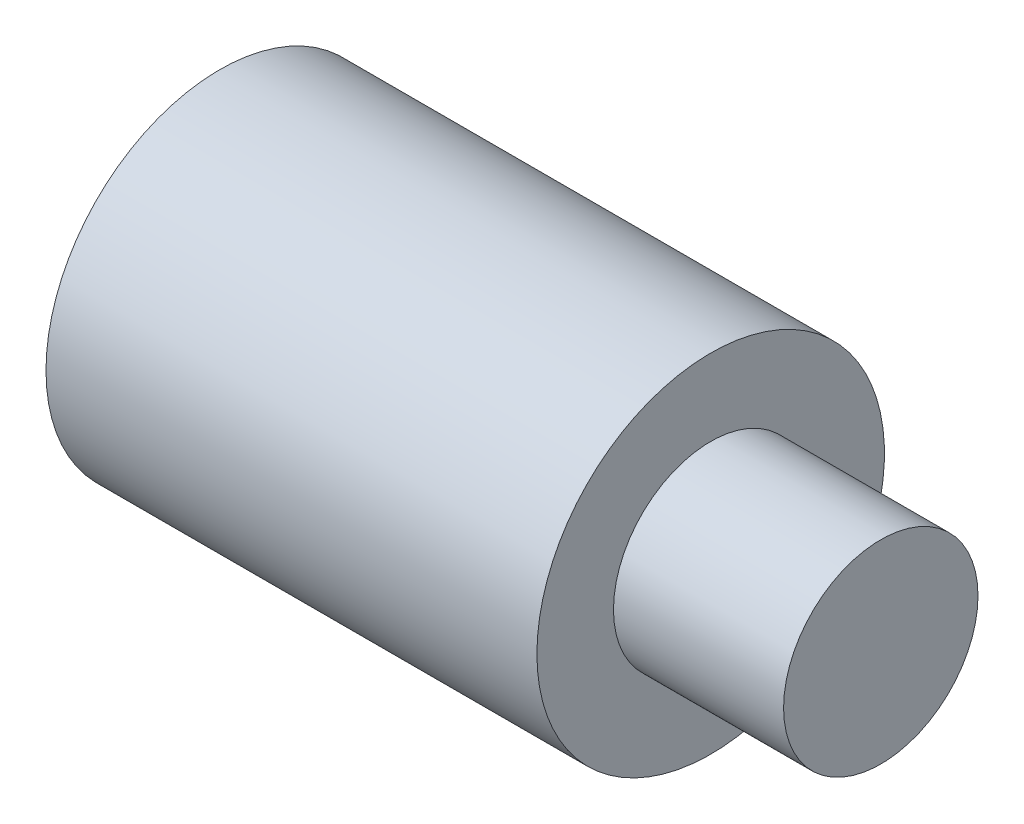
ISO-10303-21;
HEADER;
FILE_DESCRIPTION(('STEP AP214'),'2;1');
FILE_NAME('part.step','',(''),(''),'','','');
FILE_SCHEMA(('AUTOMOTIVE_DESIGN { 1 0 10303 214 1 1 1 1 }'));
ENDSEC;
DATA;
#1=APPLICATION_CONTEXT('core data for automotive mechanical design processes');
#2=APPLICATION_PROTOCOL_DEFINITION('international standard','automotive_design',2000,#1);
#3=PRODUCT_CONTEXT('',#1,'mechanical');
#4=PRODUCT('Part','Part','',(#3));
#5=PRODUCT_RELATED_PRODUCT_CATEGORY('part','',(#4));
#6=PRODUCT_DEFINITION_FORMATION('','',#4);
#7=PRODUCT_DEFINITION_CONTEXT('part definition',#1,'design');
#8=PRODUCT_DEFINITION('design','',#6,#7);
#9=PRODUCT_DEFINITION_SHAPE('','',#8);
#10=(LENGTH_UNIT() NAMED_UNIT(*) SI_UNIT(.MILLI.,.METRE.));
#11=(NAMED_UNIT(*) PLANE_ANGLE_UNIT() SI_UNIT($,.RADIAN.));
#12=(NAMED_UNIT(*) SI_UNIT($,.STERADIAN.) SOLID_ANGLE_UNIT());
#13=UNCERTAINTY_MEASURE_WITH_UNIT(LENGTH_MEASURE(1.E-05),#10,'distance_accuracy_value','');
#14=(GEOMETRIC_REPRESENTATION_CONTEXT(3) GLOBAL_UNCERTAINTY_ASSIGNED_CONTEXT((#13)) GLOBAL_UNIT_ASSIGNED_CONTEXT((#10,
#11,#12)) REPRESENTATION_CONTEXT('',''));
#15=CARTESIAN_POINT('',(0.,0.,0.));
#16=DIRECTION('',(0.,0.,1.));
#17=DIRECTION('',(1.,0.,0.));
#18=AXIS2_PLACEMENT_3D('',#15,#16,#17);
#19=CARTESIAN_POINT('',(8.6,-2.075,0.));
#20=DIRECTION('',(1.,0.,0.));
#21=DIRECTION('',(0.,0.,-1.));
#22=AXIS2_PLACEMENT_3D('',#19,#20,#21);
#23=PLANE('',#22);
#24=CARTESIAN_POINT('',(8.6,-2.075,0.));
#25=DIRECTION('',(-1.,0.,0.));
#26=DIRECTION('',(0.,0.,1.));
#27=AXIS2_PLACEMENT_3D('',#24,#25,#26);
#28=CIRCLE('',#27,2.075);
#29=CARTESIAN_POINT('',(8.6,-2.075,2.075));
#30=VERTEX_POINT('',#29);
#31=EDGE_CURVE('E10',#30,#30,#28,.T.);
#32=ORIENTED_EDGE('',*,*,#31,.T.);
#33=EDGE_LOOP('',(#32));
#34=FACE_BOUND('',#33,.T.);
#35=ADVANCED_FACE('F30',(#34),#23,.F.);
#36=CARTESIAN_POINT('',(8.6,-2.075,0.));
#37=DIRECTION('',(-1.,0.,0.));
#38=DIRECTION('',(0.,0.,1.));
#39=AXIS2_PLACEMENT_3D('',#36,#37,#38);
#40=CYLINDRICAL_SURFACE('',#39,2.075);
#41=ORIENTED_EDGE('',*,*,#31,.F.);
#42=EDGE_LOOP('',(#41));
#43=FACE_BOUND('',#42,.T.);
#44=CARTESIAN_POINT('',(0.,-2.075,0.));
#45=DIRECTION('',(-1.,0.,0.));
#46=DIRECTION('',(0.,0.,1.));
#47=AXIS2_PLACEMENT_3D('',#44,#45,#46);
#48=CIRCLE('',#47,2.075);
#49=CARTESIAN_POINT('',(0.,-2.075,2.075));
#50=VERTEX_POINT('',#49);
#51=EDGE_CURVE('E36',#50,#50,#48,.T.);
#52=ORIENTED_EDGE('',*,*,#51,.T.);
#53=EDGE_LOOP('',(#52));
#54=FACE_BOUND('',#53,.T.);
#55=ADVANCED_FACE('F68',(#43,#54),#40,.F.);
#56=CARTESIAN_POINT('',(0.,1.5,0.));
#57=DIRECTION('',(1.,0.,0.));
#58=DIRECTION('',(0.,0.,-1.));
#59=AXIS2_PLACEMENT_3D('',#56,#57,#58);
#60=PLANE('',#59);
#61=ORIENTED_EDGE('',*,*,#51,.F.);
#62=EDGE_LOOP('',(#61));
#63=FACE_BOUND('',#62,.T.);
#64=CARTESIAN_POINT('',(0.,-2.075,0.));
#65=DIRECTION('',(-1.,0.,0.));
#66=DIRECTION('',(0.,0.,1.));
#67=AXIS2_PLACEMENT_3D('',#64,#65,#66);
#68=CIRCLE('',#67,3.575);
#69=CARTESIAN_POINT('',(0.,-2.075,3.575));
#70=VERTEX_POINT('',#69);
#71=EDGE_CURVE('E40',#70,#70,#68,.T.);
#72=ORIENTED_EDGE('',*,*,#71,.T.);
#73=EDGE_LOOP('',(#72));
#74=FACE_BOUND('',#73,.T.);
#75=ADVANCED_FACE('F72',(#63,#74),#60,.F.);
#76=CARTESIAN_POINT('',(8.6,-2.075,0.));
#77=DIRECTION('',(-1.,0.,0.));
#78=DIRECTION('',(0.,0.,1.));
#79=AXIS2_PLACEMENT_3D('',#76,#77,#78);
#80=CYLINDRICAL_SURFACE('',#79,3.575);
#81=ORIENTED_EDGE('',*,*,#71,.F.);
#82=EDGE_LOOP('',(#81));
#83=FACE_BOUND('',#82,.T.);
#84=CARTESIAN_POINT('',(10.1,-2.075,0.));
#85=DIRECTION('',(-1.,0.,0.));
#86=DIRECTION('',(0.,0.,1.));
#87=AXIS2_PLACEMENT_3D('',#84,#85,#86);
#88=CIRCLE('',#87,3.575);
#89=CARTESIAN_POINT('',(10.1,-2.075,3.575));
#90=VERTEX_POINT('',#89);
#91=EDGE_CURVE('E44',#90,#90,#88,.T.);
#92=ORIENTED_EDGE('',*,*,#91,.T.);
#93=EDGE_LOOP('',(#92));
#94=FACE_BOUND('',#93,.T.);
#95=ADVANCED_FACE('F77',(#83,#94),#80,.T.);
#96=CARTESIAN_POINT('',(10.1,-0.075,0.));
#97=DIRECTION('',(-1.,0.,0.));
#98=DIRECTION('',(0.,0.,1.));
#99=AXIS2_PLACEMENT_3D('',#96,#97,#98);
#100=PLANE('',#99);
#101=ORIENTED_EDGE('',*,*,#91,.F.);
#102=EDGE_LOOP('',(#101));
#103=FACE_BOUND('',#102,.T.);
#104=CARTESIAN_POINT('',(10.1,-2.075,0.));
#105=DIRECTION('',(-1.,0.,0.));
#106=DIRECTION('',(0.,0.,1.));
#107=AXIS2_PLACEMENT_3D('',#104,#105,#106);
#108=CIRCLE('',#107,2.);
#109=CARTESIAN_POINT('',(10.1,-2.075,2.));
#110=VERTEX_POINT('',#109);
#111=EDGE_CURVE('E49',#110,#110,#108,.T.);
#112=ORIENTED_EDGE('',*,*,#111,.T.);
#113=EDGE_LOOP('',(#112));
#114=FACE_BOUND('',#113,.T.);
#115=ADVANCED_FACE('F64',(#103,#114),#100,.F.);
#116=CARTESIAN_POINT('',(8.6,-2.075,0.));
#117=DIRECTION('',(-1.,0.,0.));
#118=DIRECTION('',(0.,0.,1.));
#119=AXIS2_PLACEMENT_3D('',#116,#117,#118);
#120=CYLINDRICAL_SURFACE('',#119,2.);
#121=ORIENTED_EDGE('',*,*,#111,.F.);
#122=EDGE_LOOP('',(#121));
#123=FACE_BOUND('',#122,.T.);
#124=CARTESIAN_POINT('',(13.6,-2.075,0.));
#125=DIRECTION('',(-1.,0.,0.));
#126=DIRECTION('',(0.,0.,1.));
#127=AXIS2_PLACEMENT_3D('',#124,#125,#126);
#128=CIRCLE('',#127,2.);
#129=CARTESIAN_POINT('',(13.6,-2.075,2.));
#130=VERTEX_POINT('',#129);
#131=EDGE_CURVE('E52',#130,#130,#128,.T.);
#132=ORIENTED_EDGE('',*,*,#131,.T.);
#133=EDGE_LOOP('',(#132));
#134=FACE_BOUND('',#133,.T.);
#135=ADVANCED_FACE('F56',(#123,#134),#120,.T.);
#136=CARTESIAN_POINT('',(13.6,-2.075,0.));
#137=DIRECTION('',(-1.,0.,0.));
#138=DIRECTION('',(0.,0.,1.));
#139=AXIS2_PLACEMENT_3D('',#136,#137,#138);
#140=PLANE('',#139);
#141=ORIENTED_EDGE('',*,*,#131,.F.);
#142=EDGE_LOOP('',(#141));
#143=FACE_BOUND('',#142,.T.);
#144=ADVANCED_FACE('F58',(#143),#140,.F.);
#145=CLOSED_SHELL('',(#35,#55,#75,#95,#115,#135,#144));
#146=MANIFOLD_SOLID_BREP('B2',#145);
#147=ADVANCED_BREP_SHAPE_REPRESENTATION('',(#18,#146),#14);
#148=SHAPE_DEFINITION_REPRESENTATION(#9,#147);
ENDSEC;
END-ISO-10303-21;
